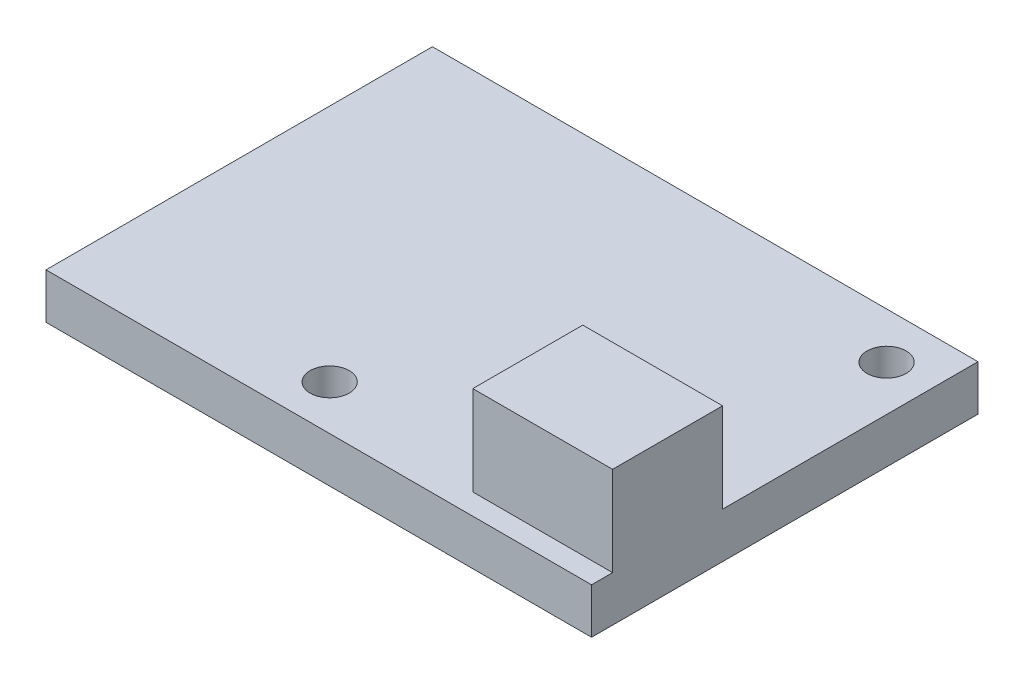
ISO-10303-21;
HEADER;
FILE_DESCRIPTION(('STEP AP214'),'2;1');
FILE_NAME('part.step','',(''),(''),'','','');
FILE_SCHEMA(('AUTOMOTIVE_DESIGN { 1 0 10303 214 1 1 1 1 }'));
ENDSEC;
DATA;
#1=APPLICATION_CONTEXT('core data for automotive mechanical design processes');
#2=APPLICATION_PROTOCOL_DEFINITION('international standard','automotive_design',2000,#1);
#3=PRODUCT_CONTEXT('',#1,'mechanical');
#4=PRODUCT('Part','Part','',(#3));
#5=PRODUCT_RELATED_PRODUCT_CATEGORY('part','',(#4));
#6=PRODUCT_DEFINITION_FORMATION('','',#4);
#7=PRODUCT_DEFINITION_CONTEXT('part definition',#1,'design');
#8=PRODUCT_DEFINITION('design','',#6,#7);
#9=PRODUCT_DEFINITION_SHAPE('','',#8);
#10=(LENGTH_UNIT() NAMED_UNIT(*) SI_UNIT(.MILLI.,.METRE.));
#11=(NAMED_UNIT(*) PLANE_ANGLE_UNIT() SI_UNIT($,.RADIAN.));
#12=(NAMED_UNIT(*) SI_UNIT($,.STERADIAN.) SOLID_ANGLE_UNIT());
#13=UNCERTAINTY_MEASURE_WITH_UNIT(LENGTH_MEASURE(1.E-05),#10,'distance_accuracy_value','');
#14=(GEOMETRIC_REPRESENTATION_CONTEXT(3) GLOBAL_UNCERTAINTY_ASSIGNED_CONTEXT((#13)) GLOBAL_UNIT_ASSIGNED_CONTEXT((#10,
#11,#12)) REPRESENTATION_CONTEXT('',''));
#15=CARTESIAN_POINT('',(0.,0.,0.));
#16=DIRECTION('',(0.,0.,1.));
#17=DIRECTION('',(1.,0.,0.));
#18=AXIS2_PLACEMENT_3D('',#15,#16,#17);
#19=CARTESIAN_POINT('',(0.,2.54,0.));
#20=DIRECTION('',(0.,-1.,0.));
#21=DIRECTION('',(0.,0.,-1.));
#22=AXIS2_PLACEMENT_3D('',#19,#20,#21);
#23=PLANE('',#22);
#24=CARTESIAN_POINT('',(27.9505116171088,2.54,-19.0121652862558));
#25=DIRECTION('',(0.,1.,0.));
#26=DIRECTION('',(0.,0.,1.));
#27=AXIS2_PLACEMENT_3D('',#24,#25,#26);
#28=CIRCLE('',#27,1.0922);
#29=CARTESIAN_POINT('',(27.9505116171088,2.54,-17.9199652862558));
#30=VERTEX_POINT('',#29);
#31=EDGE_CURVE('E145',#30,#30,#28,.T.);
#32=ORIENTED_EDGE('',*,*,#31,.F.);
#33=EDGE_LOOP('',(#32));
#34=FACE_BOUND('',#33,.T.);
#35=CARTESIAN_POINT('',(13.3455116171088,2.54,-2.50216528625582));
#36=DIRECTION('',(0.,1.,0.));
#37=DIRECTION('',(0.,0.,1.));
#38=AXIS2_PLACEMENT_3D('',#35,#36,#37);
#39=CIRCLE('',#38,1.0922);
#40=CARTESIAN_POINT('',(13.3455116171088,2.54,-1.40996528625582));
#41=VERTEX_POINT('',#40);
#42=EDGE_CURVE('E122',#41,#41,#39,.T.);
#43=ORIENTED_EDGE('',*,*,#42,.F.);
#44=EDGE_LOOP('',(#43));
#45=FACE_BOUND('',#44,.T.);
#46=DIRECTION('',(1.,0.,0.));
#47=VECTOR('',#46,1.);
#48=CARTESIAN_POINT('',(30.48,2.54,-1.17562541087901));
#49=LINE('',#48,#47);
#50=CARTESIAN_POINT('',(22.6689919667074,2.54,-1.17562541087901));
#51=VERTEX_POINT('',#50);
#52=CARTESIAN_POINT('',(30.48,2.54,-1.17562541087901));
#53=VERTEX_POINT('',#52);
#54=EDGE_CURVE('E50',#51,#53,#49,.T.);
#55=ORIENTED_EDGE('',*,*,#54,.F.);
#56=DIRECTION('',(0.,0.,1.));
#57=VECTOR('',#56,1.);
#58=CARTESIAN_POINT('',(22.6689919667074,2.54,-7.31981076006005));
#59=LINE('',#58,#57);
#60=CARTESIAN_POINT('',(22.6689919667074,2.54,-7.31981076006005));
#61=VERTEX_POINT('',#60);
#62=EDGE_CURVE('E136',#61,#51,#59,.T.);
#63=ORIENTED_EDGE('',*,*,#62,.F.);
#64=DIRECTION('',(-1.,0.,0.));
#65=VECTOR('',#64,1.);
#66=CARTESIAN_POINT('',(30.48,2.54,-7.31981076006005));
#67=LINE('',#66,#65);
#68=CARTESIAN_POINT('',(30.48,2.54,-7.31981076006005));
#69=VERTEX_POINT('',#68);
#70=EDGE_CURVE('E56',#69,#61,#67,.T.);
#71=ORIENTED_EDGE('',*,*,#70,.F.);
#72=DIRECTION('',(0.,0.,-1.));
#73=VECTOR('',#72,1.);
#74=CARTESIAN_POINT('',(30.48,2.54,0.));
#75=LINE('',#74,#73);
#76=CARTESIAN_POINT('',(30.48,2.54,-21.59));
#77=VERTEX_POINT('',#76);
#78=EDGE_CURVE('E121',#69,#77,#75,.T.);
#79=ORIENTED_EDGE('',*,*,#78,.T.);
#80=DIRECTION('',(-1.,0.,0.));
#81=VECTOR('',#80,1.);
#82=CARTESIAN_POINT('',(0.,2.54,-21.59));
#83=LINE('',#82,#81);
#84=CARTESIAN_POINT('',(0.,2.54,-21.59));
#85=VERTEX_POINT('',#84);
#86=EDGE_CURVE('E161',#77,#85,#83,.T.);
#87=ORIENTED_EDGE('',*,*,#86,.T.);
#88=DIRECTION('',(0.,0.,1.));
#89=VECTOR('',#88,1.);
#90=CARTESIAN_POINT('',(0.,2.54,0.));
#91=LINE('',#90,#89);
#92=CARTESIAN_POINT('',(0.,2.54,0.));
#93=VERTEX_POINT('',#92);
#94=EDGE_CURVE('E153',#85,#93,#91,.T.);
#95=ORIENTED_EDGE('',*,*,#94,.T.);
#96=DIRECTION('',(1.,0.,0.));
#97=VECTOR('',#96,1.);
#98=CARTESIAN_POINT('',(0.,2.54,0.));
#99=LINE('',#98,#97);
#100=CARTESIAN_POINT('',(30.48,2.54,0.));
#101=VERTEX_POINT('',#100);
#102=EDGE_CURVE('E156',#93,#101,#99,.T.);
#103=ORIENTED_EDGE('',*,*,#102,.T.);
#104=EDGE_CURVE('E166',#101,#53,#75,.T.);
#105=ORIENTED_EDGE('',*,*,#104,.T.);
#106=EDGE_LOOP('',(#55,#63,#71,#79,#87,#95,#103,#105));
#107=FACE_BOUND('',#106,.T.);
#108=ADVANCED_FACE('F33',(#34,#45,#107),#23,.F.);
#109=CARTESIAN_POINT('',(0.,2.54,0.));
#110=DIRECTION('',(1.,0.,0.));
#111=DIRECTION('',(0.,0.,-1.));
#112=AXIS2_PLACEMENT_3D('',#109,#110,#111);
#113=PLANE('',#112);
#114=DIRECTION('',(0.,0.,1.));
#115=VECTOR('',#114,1.);
#116=CARTESIAN_POINT('',(0.,0.,0.));
#117=LINE('',#116,#115);
#118=CARTESIAN_POINT('',(0.,0.,-21.59));
#119=VERTEX_POINT('',#118);
#120=CARTESIAN_POINT('',(0.,0.,0.));
#121=VERTEX_POINT('',#120);
#122=EDGE_CURVE('E150',#119,#121,#117,.T.);
#123=ORIENTED_EDGE('',*,*,#122,.T.);
#124=DIRECTION('',(0.,-1.,0.));
#125=VECTOR('',#124,1.);
#126=CARTESIAN_POINT('',(0.,2.54,0.));
#127=LINE('',#126,#125);
#128=EDGE_CURVE('E11',#93,#121,#127,.T.);
#129=ORIENTED_EDGE('',*,*,#128,.F.);
#130=ORIENTED_EDGE('',*,*,#94,.F.);
#131=DIRECTION('',(0.,-1.,0.));
#132=VECTOR('',#131,1.);
#133=CARTESIAN_POINT('',(0.,2.54,-21.59));
#134=LINE('',#133,#132);
#135=EDGE_CURVE('E173',#85,#119,#134,.T.);
#136=ORIENTED_EDGE('',*,*,#135,.T.);
#137=EDGE_LOOP('',(#123,#129,#130,#136));
#138=FACE_BOUND('',#137,.T.);
#139=ADVANCED_FACE('F35',(#138),#113,.F.);
#140=CARTESIAN_POINT('',(0.,2.54,0.));
#141=DIRECTION('',(0.,0.,-1.));
#142=DIRECTION('',(-1.,0.,0.));
#143=AXIS2_PLACEMENT_3D('',#140,#141,#142);
#144=PLANE('',#143);
#145=DIRECTION('',(1.,0.,0.));
#146=VECTOR('',#145,1.);
#147=CARTESIAN_POINT('',(0.,0.,0.));
#148=LINE('',#147,#146);
#149=CARTESIAN_POINT('',(30.48,0.,0.));
#150=VERTEX_POINT('',#149);
#151=EDGE_CURVE('E179',#121,#150,#148,.T.);
#152=ORIENTED_EDGE('',*,*,#151,.T.);
#153=DIRECTION('',(0.,-1.,0.));
#154=VECTOR('',#153,1.);
#155=CARTESIAN_POINT('',(30.48,2.54,0.));
#156=LINE('',#155,#154);
#157=EDGE_CURVE('E42',#101,#150,#156,.T.);
#158=ORIENTED_EDGE('',*,*,#157,.F.);
#159=ORIENTED_EDGE('',*,*,#102,.F.);
#160=ORIENTED_EDGE('',*,*,#128,.T.);
#161=EDGE_LOOP('',(#152,#158,#159,#160));
#162=FACE_BOUND('',#161,.T.);
#163=ADVANCED_FACE('F192',(#162),#144,.F.);
#164=CARTESIAN_POINT('',(30.48,2.54,0.));
#165=DIRECTION('',(-1.,0.,0.));
#166=DIRECTION('',(0.,0.,1.));
#167=AXIS2_PLACEMENT_3D('',#164,#165,#166);
#168=PLANE('',#167);
#169=DIRECTION('',(0.,0.,-1.));
#170=VECTOR('',#169,1.);
#171=CARTESIAN_POINT('',(30.48,0.,0.));
#172=LINE('',#171,#170);
#173=CARTESIAN_POINT('',(30.48,0.,-21.59));
#174=VERTEX_POINT('',#173);
#175=EDGE_CURVE('E177',#150,#174,#172,.T.);
#176=ORIENTED_EDGE('',*,*,#175,.T.);
#177=DIRECTION('',(0.,-1.,0.));
#178=VECTOR('',#177,1.);
#179=CARTESIAN_POINT('',(30.48,2.54,-21.59));
#180=LINE('',#179,#178);
#181=EDGE_CURVE('E170',#77,#174,#180,.T.);
#182=ORIENTED_EDGE('',*,*,#181,.F.);
#183=ORIENTED_EDGE('',*,*,#78,.F.);
#184=DIRECTION('',(0.,-1.,0.));
#185=VECTOR('',#184,1.);
#186=CARTESIAN_POINT('',(30.48,7.54,-7.31981076006005));
#187=LINE('',#186,#185);
#188=CARTESIAN_POINT('',(30.48,7.54,-7.31981076006005));
#189=VERTEX_POINT('',#188);
#190=EDGE_CURVE('E103',#189,#69,#187,.T.);
#191=ORIENTED_EDGE('',*,*,#190,.F.);
#192=DIRECTION('',(0.,0.,-1.));
#193=VECTOR('',#192,1.);
#194=CARTESIAN_POINT('',(30.48,7.54,-7.31981076006005));
#195=LINE('',#194,#193);
#196=CARTESIAN_POINT('',(30.48,7.54,-1.17562541087901));
#197=VERTEX_POINT('',#196);
#198=EDGE_CURVE('E109',#197,#189,#195,.T.);
#199=ORIENTED_EDGE('',*,*,#198,.F.);
#200=DIRECTION('',(0.,-1.,0.));
#201=VECTOR('',#200,1.);
#202=CARTESIAN_POINT('',(30.48,7.54,-1.17562541087901));
#203=LINE('',#202,#201);
#204=EDGE_CURVE('E137',#197,#53,#203,.T.);
#205=ORIENTED_EDGE('',*,*,#204,.T.);
#206=ORIENTED_EDGE('',*,*,#104,.F.);
#207=ORIENTED_EDGE('',*,*,#157,.T.);
#208=EDGE_LOOP('',(#176,#182,#183,#191,#199,#205,#206,#207));
#209=FACE_BOUND('',#208,.T.);
#210=ADVANCED_FACE('F119',(#209),#168,.F.);
#211=CARTESIAN_POINT('',(0.,2.54,-21.59));
#212=DIRECTION('',(0.,0.,1.));
#213=DIRECTION('',(1.,0.,0.));
#214=AXIS2_PLACEMENT_3D('',#211,#212,#213);
#215=PLANE('',#214);
#216=DIRECTION('',(-1.,0.,0.));
#217=VECTOR('',#216,1.);
#218=CARTESIAN_POINT('',(0.,0.,-21.59));
#219=LINE('',#218,#217);
#220=EDGE_CURVE('E157',#174,#119,#219,.T.);
#221=ORIENTED_EDGE('',*,*,#220,.T.);
#222=ORIENTED_EDGE('',*,*,#135,.F.);
#223=ORIENTED_EDGE('',*,*,#86,.F.);
#224=ORIENTED_EDGE('',*,*,#181,.T.);
#225=EDGE_LOOP('',(#221,#222,#223,#224));
#226=FACE_BOUND('',#225,.T.);
#227=ADVANCED_FACE('F196',(#226),#215,.F.);
#228=CARTESIAN_POINT('',(0.,0.,0.));
#229=DIRECTION('',(0.,-1.,0.));
#230=DIRECTION('',(0.,0.,-1.));
#231=AXIS2_PLACEMENT_3D('',#228,#229,#230);
#232=PLANE('',#231);
#233=CARTESIAN_POINT('',(13.3455116171088,0.,-2.50216528625582));
#234=DIRECTION('',(0.,1.,0.));
#235=DIRECTION('',(0.,0.,1.));
#236=AXIS2_PLACEMENT_3D('',#233,#234,#235);
#237=CIRCLE('',#236,1.0922);
#238=CARTESIAN_POINT('',(13.3455116171088,0.,-1.40996528625582));
#239=VERTEX_POINT('',#238);
#240=EDGE_CURVE('E125',#239,#239,#237,.T.);
#241=ORIENTED_EDGE('',*,*,#240,.T.);
#242=EDGE_LOOP('',(#241));
#243=FACE_BOUND('',#242,.T.);
#244=CARTESIAN_POINT('',(27.9505116171088,0.,-19.0121652862558));
#245=DIRECTION('',(0.,1.,0.));
#246=DIRECTION('',(0.,0.,1.));
#247=AXIS2_PLACEMENT_3D('',#244,#245,#246);
#248=CIRCLE('',#247,1.0922);
#249=CARTESIAN_POINT('',(27.9505116171088,0.,-17.9199652862558));
#250=VERTEX_POINT('',#249);
#251=EDGE_CURVE('E147',#250,#250,#248,.T.);
#252=ORIENTED_EDGE('',*,*,#251,.T.);
#253=EDGE_LOOP('',(#252));
#254=FACE_BOUND('',#253,.T.);
#255=ORIENTED_EDGE('',*,*,#122,.F.);
#256=ORIENTED_EDGE('',*,*,#220,.F.);
#257=ORIENTED_EDGE('',*,*,#175,.F.);
#258=ORIENTED_EDGE('',*,*,#151,.F.);
#259=EDGE_LOOP('',(#255,#256,#257,#258));
#260=FACE_BOUND('',#259,.T.);
#261=ADVANCED_FACE('F188',(#243,#254,#260),#232,.T.);
#262=CARTESIAN_POINT('',(27.9505116171088,0.,-19.0121652862558));
#263=DIRECTION('',(0.,1.,0.));
#264=DIRECTION('',(0.,0.,1.));
#265=AXIS2_PLACEMENT_3D('',#262,#263,#264);
#266=CYLINDRICAL_SURFACE('',#265,1.0922);
#267=ORIENTED_EDGE('',*,*,#251,.F.);
#268=EDGE_LOOP('',(#267));
#269=FACE_BOUND('',#268,.T.);
#270=ORIENTED_EDGE('',*,*,#31,.T.);
#271=EDGE_LOOP('',(#270));
#272=FACE_BOUND('',#271,.T.);
#273=ADVANCED_FACE('F224',(#269,#272),#266,.F.);
#274=CARTESIAN_POINT('',(13.3455116171088,0.,-2.50216528625582));
#275=DIRECTION('',(0.,1.,0.));
#276=DIRECTION('',(0.,0.,1.));
#277=AXIS2_PLACEMENT_3D('',#274,#275,#276);
#278=CYLINDRICAL_SURFACE('',#277,1.0922);
#279=ORIENTED_EDGE('',*,*,#240,.F.);
#280=EDGE_LOOP('',(#279));
#281=FACE_BOUND('',#280,.T.);
#282=ORIENTED_EDGE('',*,*,#42,.T.);
#283=EDGE_LOOP('',(#282));
#284=FACE_BOUND('',#283,.T.);
#285=ADVANCED_FACE('F210',(#281,#284),#278,.F.);
#286=CARTESIAN_POINT('',(30.48,7.54,-7.31981076006005));
#287=DIRECTION('',(0.,0.,1.));
#288=DIRECTION('',(1.,0.,0.));
#289=AXIS2_PLACEMENT_3D('',#286,#287,#288);
#290=PLANE('',#289);
#291=ORIENTED_EDGE('',*,*,#70,.T.);
#292=DIRECTION('',(0.,-1.,0.));
#293=VECTOR('',#292,1.);
#294=CARTESIAN_POINT('',(22.6689919667074,7.54,-7.31981076006005));
#295=LINE('',#294,#293);
#296=CARTESIAN_POINT('',(22.6689919667074,7.54,-7.31981076006005));
#297=VERTEX_POINT('',#296);
#298=EDGE_CURVE('E105',#297,#61,#295,.T.);
#299=ORIENTED_EDGE('',*,*,#298,.F.);
#300=DIRECTION('',(-1.,0.,0.));
#301=VECTOR('',#300,1.);
#302=CARTESIAN_POINT('',(30.48,7.54,-7.31981076006005));
#303=LINE('',#302,#301);
#304=EDGE_CURVE('E99',#189,#297,#303,.T.);
#305=ORIENTED_EDGE('',*,*,#304,.F.);
#306=ORIENTED_EDGE('',*,*,#190,.T.);
#307=EDGE_LOOP('',(#291,#299,#305,#306));
#308=FACE_BOUND('',#307,.T.);
#309=ADVANCED_FACE('F101',(#308),#290,.F.);
#310=CARTESIAN_POINT('',(22.6689919667074,7.54,-7.31981076006005));
#311=DIRECTION('',(1.,0.,0.));
#312=DIRECTION('',(0.,0.,-1.));
#313=AXIS2_PLACEMENT_3D('',#310,#311,#312);
#314=PLANE('',#313);
#315=ORIENTED_EDGE('',*,*,#62,.T.);
#316=DIRECTION('',(0.,-1.,0.));
#317=VECTOR('',#316,1.);
#318=CARTESIAN_POINT('',(22.6689919667074,7.54,-1.17562541087901));
#319=LINE('',#318,#317);
#320=CARTESIAN_POINT('',(22.6689919667074,7.54,-1.17562541087901));
#321=VERTEX_POINT('',#320);
#322=EDGE_CURVE('E127',#321,#51,#319,.T.);
#323=ORIENTED_EDGE('',*,*,#322,.F.);
#324=DIRECTION('',(0.,0.,1.));
#325=VECTOR('',#324,1.);
#326=CARTESIAN_POINT('',(22.6689919667074,7.54,-7.31981076006005));
#327=LINE('',#326,#325);
#328=EDGE_CURVE('E108',#297,#321,#327,.T.);
#329=ORIENTED_EDGE('',*,*,#328,.F.);
#330=ORIENTED_EDGE('',*,*,#298,.T.);
#331=EDGE_LOOP('',(#315,#323,#329,#330));
#332=FACE_BOUND('',#331,.T.);
#333=ADVANCED_FACE('F201',(#332),#314,.F.);
#334=CARTESIAN_POINT('',(30.48,7.54,-1.17562541087901));
#335=DIRECTION('',(0.,0.,-1.));
#336=DIRECTION('',(-1.,0.,0.));
#337=AXIS2_PLACEMENT_3D('',#334,#335,#336);
#338=PLANE('',#337);
#339=ORIENTED_EDGE('',*,*,#54,.T.);
#340=ORIENTED_EDGE('',*,*,#204,.F.);
#341=DIRECTION('',(1.,0.,0.));
#342=VECTOR('',#341,1.);
#343=CARTESIAN_POINT('',(30.48,7.54,-1.17562541087901));
#344=LINE('',#343,#342);
#345=EDGE_CURVE('E114',#321,#197,#344,.T.);
#346=ORIENTED_EDGE('',*,*,#345,.F.);
#347=ORIENTED_EDGE('',*,*,#322,.T.);
#348=EDGE_LOOP('',(#339,#340,#346,#347));
#349=FACE_BOUND('',#348,.T.);
#350=ADVANCED_FACE('F198',(#349),#338,.F.);
#351=CARTESIAN_POINT('',(0.,7.54,0.));
#352=DIRECTION('',(0.,-1.,0.));
#353=DIRECTION('',(0.,0.,-1.));
#354=AXIS2_PLACEMENT_3D('',#351,#352,#353);
#355=PLANE('',#354);
#356=ORIENTED_EDGE('',*,*,#198,.T.);
#357=ORIENTED_EDGE('',*,*,#304,.T.);
#358=ORIENTED_EDGE('',*,*,#328,.T.);
#359=ORIENTED_EDGE('',*,*,#345,.T.);
#360=EDGE_LOOP('',(#356,#357,#358,#359));
#361=FACE_BOUND('',#360,.T.);
#362=ADVANCED_FACE('F112',(#361),#355,.F.);
#363=CLOSED_SHELL('',(#108,#139,#163,#210,#227,#261,#273,#285,#309,#333,#350,#362));
#364=MANIFOLD_SOLID_BREP('B2',#363);
#365=ADVANCED_BREP_SHAPE_REPRESENTATION('',(#18,#364),#14);
#366=SHAPE_DEFINITION_REPRESENTATION(#9,#365);
ENDSEC;
END-ISO-10303-21;
